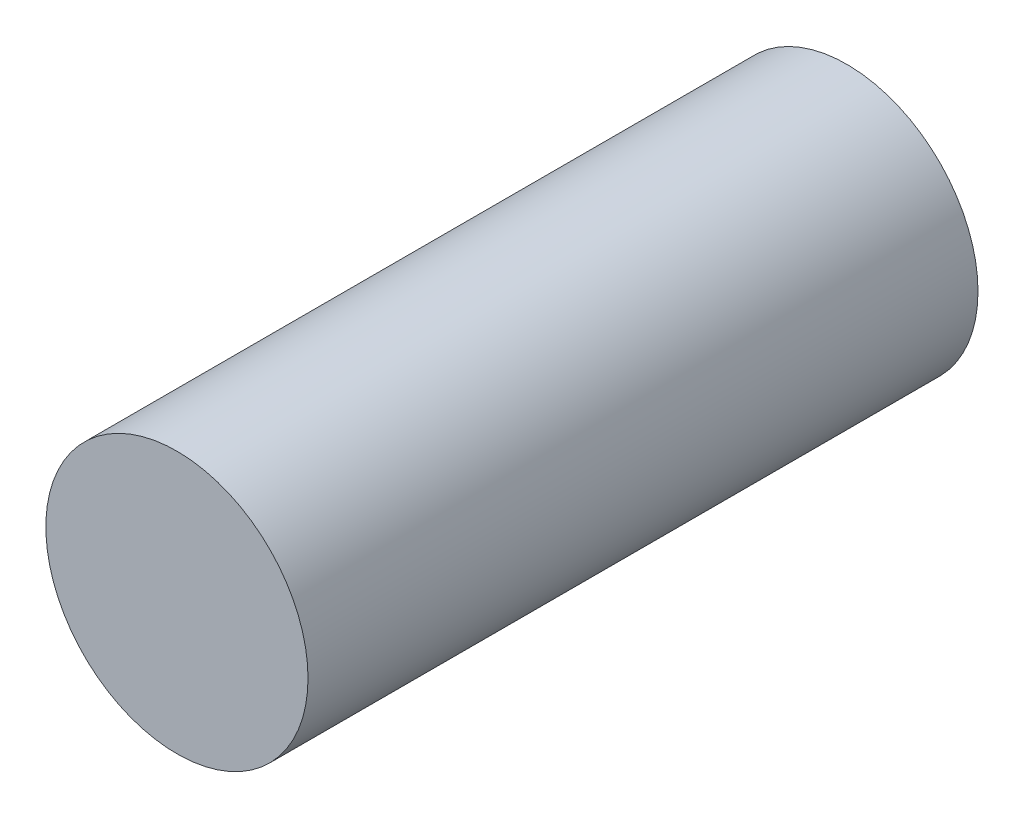
ISO-10303-21;
HEADER;
FILE_DESCRIPTION(('STEP AP214'),'2;1');
FILE_NAME('part.step','',(''),(''),'','','');
FILE_SCHEMA(('AUTOMOTIVE_DESIGN { 1 0 10303 214 1 1 1 1 }'));
ENDSEC;
DATA;
#1=APPLICATION_CONTEXT('core data for automotive mechanical design processes');
#2=APPLICATION_PROTOCOL_DEFINITION('international standard','automotive_design',2000,#1);
#3=PRODUCT_CONTEXT('',#1,'mechanical');
#4=PRODUCT('Part','Part','',(#3));
#5=PRODUCT_RELATED_PRODUCT_CATEGORY('part','',(#4));
#6=PRODUCT_DEFINITION_FORMATION('','',#4);
#7=PRODUCT_DEFINITION_CONTEXT('part definition',#1,'design');
#8=PRODUCT_DEFINITION('design','',#6,#7);
#9=PRODUCT_DEFINITION_SHAPE('','',#8);
#10=(LENGTH_UNIT() NAMED_UNIT(*) SI_UNIT(.MILLI.,.METRE.));
#11=(NAMED_UNIT(*) PLANE_ANGLE_UNIT() SI_UNIT($,.RADIAN.));
#12=(NAMED_UNIT(*) SI_UNIT($,.STERADIAN.) SOLID_ANGLE_UNIT());
#13=UNCERTAINTY_MEASURE_WITH_UNIT(LENGTH_MEASURE(1.E-05),#10,'distance_accuracy_value','');
#14=(GEOMETRIC_REPRESENTATION_CONTEXT(3) GLOBAL_UNCERTAINTY_ASSIGNED_CONTEXT((#13)) GLOBAL_UNIT_ASSIGNED_CONTEXT((#10,
#11,#12)) REPRESENTATION_CONTEXT('',''));
#15=CARTESIAN_POINT('',(0.,0.,0.));
#16=DIRECTION('',(0.,0.,1.));
#17=DIRECTION('',(1.,0.,0.));
#18=AXIS2_PLACEMENT_3D('',#15,#16,#17);
#19=CARTESIAN_POINT('',(0.,14.,0.));
#20=DIRECTION('',(0.,0.,-1.));
#21=DIRECTION('',(-1.,0.,0.));
#22=AXIS2_PLACEMENT_3D('',#19,#20,#21);
#23=CYLINDRICAL_SURFACE('',#22,4.5);
#24=CARTESIAN_POINT('',(0.,14.,0.));
#25=DIRECTION('',(0.,0.,1.));
#26=DIRECTION('',(1.,0.,0.));
#27=AXIS2_PLACEMENT_3D('',#24,#25,#26);
#28=CIRCLE('',#27,4.5);
#29=CARTESIAN_POINT('',(4.5,14.,0.));
#30=VERTEX_POINT('',#29);
#31=EDGE_CURVE('E10',#30,#30,#28,.T.);
#32=ORIENTED_EDGE('',*,*,#31,.F.);
#33=EDGE_LOOP('',(#32));
#34=FACE_BOUND('',#33,.T.);
#35=CARTESIAN_POINT('',(0.,14.,-23.));
#36=DIRECTION('',(0.,0.,1.));
#37=DIRECTION('',(1.,0.,0.));
#38=AXIS2_PLACEMENT_3D('',#35,#36,#37);
#39=CIRCLE('',#38,4.5);
#40=CARTESIAN_POINT('',(4.5,14.,-23.));
#41=VERTEX_POINT('',#40);
#42=EDGE_CURVE('E45',#41,#41,#39,.T.);
#43=ORIENTED_EDGE('',*,*,#42,.T.);
#44=EDGE_LOOP('',(#43));
#45=FACE_BOUND('',#44,.T.);
#46=ADVANCED_FACE('F39',(#34,#45),#23,.T.);
#47=CARTESIAN_POINT('',(0.,14.,0.));
#48=DIRECTION('',(0.,0.,1.));
#49=DIRECTION('',(1.,0.,0.));
#50=AXIS2_PLACEMENT_3D('',#47,#48,#49);
#51=PLANE('',#50);
#52=ORIENTED_EDGE('',*,*,#31,.T.);
#53=EDGE_LOOP('',(#52));
#54=FACE_BOUND('',#53,.T.);
#55=ADVANCED_FACE('F53',(#54),#51,.T.);
#56=CARTESIAN_POINT('',(0.,14.,-23.));
#57=DIRECTION('',(0.,0.,1.));
#58=DIRECTION('',(1.,0.,0.));
#59=AXIS2_PLACEMENT_3D('',#56,#57,#58);
#60=PLANE('',#59);
#61=ORIENTED_EDGE('',*,*,#42,.F.);
#62=EDGE_LOOP('',(#61));
#63=FACE_BOUND('',#62,.T.);
#64=ADVANCED_FACE('F55',(#63),#60,.F.);
#65=CLOSED_SHELL('',(#46,#55,#64));
#66=MANIFOLD_SOLID_BREP('B2',#65);
#67=ADVANCED_BREP_SHAPE_REPRESENTATION('',(#18,#66),#14);
#68=SHAPE_DEFINITION_REPRESENTATION(#9,#67);
ENDSEC;
END-ISO-10303-21;
